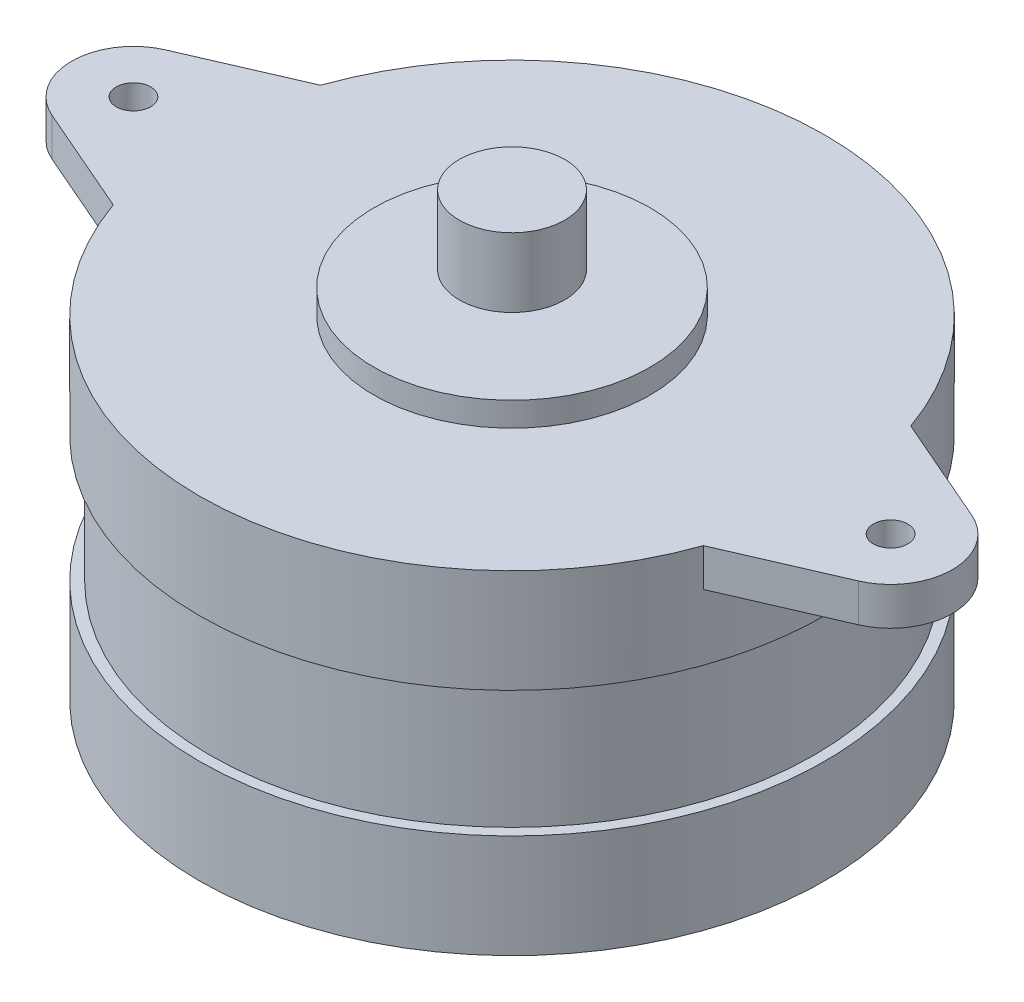
ISO-10303-21;
HEADER;
FILE_DESCRIPTION(('STEP AP214'),'2;1');
FILE_NAME('part.step','',(''),(''),'','','');
FILE_SCHEMA(('AUTOMOTIVE_DESIGN { 1 0 10303 214 1 1 1 1 }'));
ENDSEC;
DATA;
#1=APPLICATION_CONTEXT('core data for automotive mechanical design processes');
#2=APPLICATION_PROTOCOL_DEFINITION('international standard','automotive_design',2000,#1);
#3=PRODUCT_CONTEXT('',#1,'mechanical');
#4=PRODUCT('Part','Part','',(#3));
#5=PRODUCT_RELATED_PRODUCT_CATEGORY('part','',(#4));
#6=PRODUCT_DEFINITION_FORMATION('','',#4);
#7=PRODUCT_DEFINITION_CONTEXT('part definition',#1,'design');
#8=PRODUCT_DEFINITION('design','',#6,#7);
#9=PRODUCT_DEFINITION_SHAPE('','',#8);
#10=(LENGTH_UNIT() NAMED_UNIT(*) SI_UNIT(.MILLI.,.METRE.));
#11=(NAMED_UNIT(*) PLANE_ANGLE_UNIT() SI_UNIT($,.RADIAN.));
#12=(NAMED_UNIT(*) SI_UNIT($,.STERADIAN.) SOLID_ANGLE_UNIT());
#13=UNCERTAINTY_MEASURE_WITH_UNIT(LENGTH_MEASURE(1.E-05),#10,'distance_accuracy_value','');
#14=(GEOMETRIC_REPRESENTATION_CONTEXT(3) GLOBAL_UNCERTAINTY_ASSIGNED_CONTEXT((#13)) GLOBAL_UNIT_ASSIGNED_CONTEXT((#10,
#11,#12)) REPRESENTATION_CONTEXT('',''));
#15=CARTESIAN_POINT('',(0.,0.,0.));
#16=DIRECTION('',(0.,0.,1.));
#17=DIRECTION('',(1.,0.,0.));
#18=AXIS2_PLACEMENT_3D('',#15,#16,#17);
#19=CARTESIAN_POINT('',(0.,25.6,0.));
#20=DIRECTION('',(0.,1.,0.));
#21=DIRECTION('',(0.,0.,1.));
#22=AXIS2_PLACEMENT_3D('',#19,#20,#21);
#23=PLANE('',#22);
#24=CARTESIAN_POINT('',(0.,25.6,0.));
#25=DIRECTION('',(0.,-1.,0.));
#26=DIRECTION('',(0.,0.,-1.));
#27=AXIS2_PLACEMENT_3D('',#24,#25,#26);
#28=CIRCLE('',#27,3.05);
#29=CARTESIAN_POINT('',(0.,25.6,-3.05));
#30=VERTEX_POINT('',#29);
#31=EDGE_CURVE('E11',#30,#30,#28,.T.);
#32=ORIENTED_EDGE('',*,*,#31,.F.);
#33=EDGE_LOOP('',(#32));
#34=FACE_BOUND('',#33,.T.);
#35=ADVANCED_FACE('F41',(#34),#23,.T.);
#36=CARTESIAN_POINT('',(0.,0.,0.));
#37=DIRECTION('',(0.,-1.,0.));
#38=DIRECTION('',(0.,0.,-1.));
#39=AXIS2_PLACEMENT_3D('',#36,#37,#38);
#40=CYLINDRICAL_SURFACE('',#39,3.05);
#41=ORIENTED_EDGE('',*,*,#31,.T.);
#42=EDGE_LOOP('',(#41));
#43=FACE_BOUND('',#42,.T.);
#44=CARTESIAN_POINT('',(0.,21.6,0.));
#45=DIRECTION('',(0.,-1.,0.));
#46=DIRECTION('',(0.,0.,-1.));
#47=AXIS2_PLACEMENT_3D('',#44,#45,#46);
#48=CIRCLE('',#47,3.05);
#49=CARTESIAN_POINT('',(0.,21.6,-3.05));
#50=VERTEX_POINT('',#49);
#51=EDGE_CURVE('E48',#50,#50,#48,.T.);
#52=ORIENTED_EDGE('',*,*,#51,.F.);
#53=EDGE_LOOP('',(#52));
#54=FACE_BOUND('',#53,.T.);
#55=ADVANCED_FACE('F215',(#43,#54),#40,.T.);
#56=CARTESIAN_POINT('',(3.05,21.6,0.));
#57=DIRECTION('',(0.,-1.,0.));
#58=DIRECTION('',(0.,0.,-1.));
#59=AXIS2_PLACEMENT_3D('',#56,#57,#58);
#60=PLANE('',#59);
#61=ORIENTED_EDGE('',*,*,#51,.T.);
#62=EDGE_LOOP('',(#61));
#63=FACE_BOUND('',#62,.T.);
#64=CARTESIAN_POINT('',(0.,21.6,0.));
#65=DIRECTION('',(0.,-1.,0.));
#66=DIRECTION('',(0.,0.,-1.));
#67=AXIS2_PLACEMENT_3D('',#64,#65,#66);
#68=CIRCLE('',#67,1.25);
#69=CARTESIAN_POINT('',(0.,21.6,-1.25));
#70=VERTEX_POINT('',#69);
#71=EDGE_CURVE('E207',#70,#70,#68,.T.);
#72=ORIENTED_EDGE('',*,*,#71,.F.);
#73=EDGE_LOOP('',(#72));
#74=FACE_BOUND('',#73,.T.);
#75=ADVANCED_FACE('F212',(#63,#74),#60,.T.);
#76=CARTESIAN_POINT('',(0.,0.,0.));
#77=DIRECTION('',(0.,-1.,0.));
#78=DIRECTION('',(0.,0.,-1.));
#79=AXIS2_PLACEMENT_3D('',#76,#77,#78);
#80=CYLINDRICAL_SURFACE('',#79,1.25);
#81=ORIENTED_EDGE('',*,*,#71,.T.);
#82=EDGE_LOOP('',(#81));
#83=FACE_BOUND('',#82,.T.);
#84=CARTESIAN_POINT('',(0.,20.7,0.));
#85=DIRECTION('',(0.,-1.,0.));
#86=DIRECTION('',(0.,0.,-1.));
#87=AXIS2_PLACEMENT_3D('',#84,#85,#86);
#88=CIRCLE('',#87,1.25);
#89=CARTESIAN_POINT('',(0.,20.7,-1.25));
#90=VERTEX_POINT('',#89);
#91=EDGE_CURVE('E204',#90,#90,#88,.T.);
#92=ORIENTED_EDGE('',*,*,#91,.F.);
#93=EDGE_LOOP('',(#92));
#94=FACE_BOUND('',#93,.T.);
#95=ADVANCED_FACE('F222',(#83,#94),#80,.T.);
#96=CARTESIAN_POINT('',(1.25,20.7,0.));
#97=DIRECTION('',(0.,1.,0.));
#98=DIRECTION('',(0.,0.,1.));
#99=AXIS2_PLACEMENT_3D('',#96,#97,#98);
#100=PLANE('',#99);
#101=ORIENTED_EDGE('',*,*,#91,.T.);
#102=EDGE_LOOP('',(#101));
#103=FACE_BOUND('',#102,.T.);
#104=CARTESIAN_POINT('',(0.,20.7,0.));
#105=DIRECTION('',(0.,-1.,0.));
#106=DIRECTION('',(0.,0.,-1.));
#107=AXIS2_PLACEMENT_3D('',#104,#105,#106);
#108=CIRCLE('',#107,8.);
#109=CARTESIAN_POINT('',(0.,20.7,-8.));
#110=VERTEX_POINT('',#109);
#111=EDGE_CURVE('E201',#110,#110,#108,.T.);
#112=ORIENTED_EDGE('',*,*,#111,.F.);
#113=EDGE_LOOP('',(#112));
#114=FACE_BOUND('',#113,.T.);
#115=ADVANCED_FACE('F228',(#103,#114),#100,.T.);
#116=CARTESIAN_POINT('',(0.,0.,0.));
#117=DIRECTION('',(0.,-1.,0.));
#118=DIRECTION('',(0.,0.,-1.));
#119=AXIS2_PLACEMENT_3D('',#116,#117,#118);
#120=CYLINDRICAL_SURFACE('',#119,8.);
#121=ORIENTED_EDGE('',*,*,#111,.T.);
#122=EDGE_LOOP('',(#121));
#123=FACE_BOUND('',#122,.T.);
#124=CARTESIAN_POINT('',(0.,19.3,0.));
#125=DIRECTION('',(0.,-1.,0.));
#126=DIRECTION('',(0.,0.,-1.));
#127=AXIS2_PLACEMENT_3D('',#124,#125,#126);
#128=CIRCLE('',#127,8.);
#129=CARTESIAN_POINT('',(0.,19.3,-8.));
#130=VERTEX_POINT('',#129);
#131=EDGE_CURVE('E198',#130,#130,#128,.T.);
#132=ORIENTED_EDGE('',*,*,#131,.F.);
#133=EDGE_LOOP('',(#132));
#134=FACE_BOUND('',#133,.T.);
#135=ADVANCED_FACE('F232',(#123,#134),#120,.T.);
#136=CARTESIAN_POINT('',(8.,19.3,0.));
#137=DIRECTION('',(0.,1.,0.));
#138=DIRECTION('',(0.,0.,1.));
#139=AXIS2_PLACEMENT_3D('',#136,#137,#138);
#140=PLANE('',#139);
#141=ORIENTED_EDGE('',*,*,#131,.T.);
#142=EDGE_LOOP('',(#141));
#143=FACE_BOUND('',#142,.T.);
#144=CARTESIAN_POINT('',(0.,19.3,0.));
#145=DIRECTION('',(0.,-1.,0.));
#146=DIRECTION('',(0.,0.,-1.));
#147=AXIS2_PLACEMENT_3D('',#144,#145,#146);
#148=CIRCLE('',#147,18.11);
#149=CARTESIAN_POINT('',(-17.087191109132,19.3,-6.));
#150=VERTEX_POINT('',#149);
#151=CARTESIAN_POINT('',(17.087191109132,19.3,-6.));
#152=VERTEX_POINT('',#151);
#153=EDGE_CURVE('E196',#150,#152,#148,.T.);
#154=ORIENTED_EDGE('',*,*,#153,.F.);
#155=DIRECTION('',(-0.917335551166195,0.,0.398114916282488));
#156=VECTOR('',#155,1.);
#157=CARTESIAN_POINT('',(-23.3452514002913,19.3,-3.28406127317498));
#158=LINE('',#157,#156);
#159=CARTESIAN_POINT('',(-23.3452514002913,19.3,-3.28406127317498));
#160=VERTEX_POINT('',#159);
#161=EDGE_CURVE('E148',#150,#160,#158,.T.);
#162=ORIENTED_EDGE('',*,*,#161,.T.);
#163=CARTESIAN_POINT('',(-21.92,19.3,0.));
#164=DIRECTION('',(0.,1.,0.));
#165=DIRECTION('',(0.,0.,-1.));
#166=AXIS2_PLACEMENT_3D('',#163,#164,#165);
#167=CIRCLE('',#166,3.58);
#168=CARTESIAN_POINT('',(-23.3452514002913,19.3,3.28406127317498));
#169=VERTEX_POINT('',#168);
#170=EDGE_CURVE('E166',#160,#169,#167,.T.);
#171=ORIENTED_EDGE('',*,*,#170,.T.);
#172=DIRECTION('',(0.917335551166195,0.,0.398114916282488));
#173=VECTOR('',#172,1.);
#174=CARTESIAN_POINT('',(-23.3452514002913,19.3,3.28406127317498));
#175=LINE('',#174,#173);
#176=CARTESIAN_POINT('',(-17.087191109132,19.3,6.));
#177=VERTEX_POINT('',#176);
#178=EDGE_CURVE('E154',#169,#177,#175,.T.);
#179=ORIENTED_EDGE('',*,*,#178,.T.);
#180=CARTESIAN_POINT('',(17.087191109132,19.3,6.));
#181=VERTEX_POINT('',#180);
#182=EDGE_CURVE('E195',#181,#177,#148,.T.);
#183=ORIENTED_EDGE('',*,*,#182,.F.);
#184=DIRECTION('',(0.917335551166195,0.,-0.398114916282488));
#185=VECTOR('',#184,1.);
#186=CARTESIAN_POINT('',(17.087191109132,19.3,6.));
#187=LINE('',#186,#185);
#188=CARTESIAN_POINT('',(23.3452514002913,19.3,3.28406127317497));
#189=VERTEX_POINT('',#188);
#190=EDGE_CURVE('E123',#181,#189,#187,.T.);
#191=ORIENTED_EDGE('',*,*,#190,.T.);
#192=CARTESIAN_POINT('',(21.92,19.3,0.));
#193=DIRECTION('',(0.,1.,0.));
#194=DIRECTION('',(0.,0.,-1.));
#195=AXIS2_PLACEMENT_3D('',#192,#193,#194);
#196=CIRCLE('',#195,3.57999999999999);
#197=CARTESIAN_POINT('',(23.3452514002913,19.3,-3.28406127317498));
#198=VERTEX_POINT('',#197);
#199=EDGE_CURVE('E107',#189,#198,#196,.T.);
#200=ORIENTED_EDGE('',*,*,#199,.T.);
#201=DIRECTION('',(-0.917335551166195,0.,-0.398114916282489));
#202=VECTOR('',#201,1.);
#203=CARTESIAN_POINT('',(17.087191109132,19.3,-6.));
#204=LINE('',#203,#202);
#205=EDGE_CURVE('E121',#198,#152,#204,.T.);
#206=ORIENTED_EDGE('',*,*,#205,.T.);
#207=EDGE_LOOP('',(#154,#162,#171,#179,#183,#191,#200,#206));
#208=FACE_BOUND('',#207,.T.);
#209=CARTESIAN_POINT('',(-21.92,19.3,0.));
#210=DIRECTION('',(0.,1.,0.));
#211=DIRECTION('',(0.,0.,1.));
#212=AXIS2_PLACEMENT_3D('',#209,#210,#211);
#213=CIRCLE('',#212,0.999999999999998);
#214=CARTESIAN_POINT('',(-21.92,19.3,0.999999999999998));
#215=VERTEX_POINT('',#214);
#216=EDGE_CURVE('E142',#215,#215,#213,.T.);
#217=ORIENTED_EDGE('',*,*,#216,.F.);
#218=EDGE_LOOP('',(#217));
#219=FACE_BOUND('',#218,.T.);
#220=CARTESIAN_POINT('',(21.92,19.3,0.));
#221=DIRECTION('',(0.,1.,0.));
#222=DIRECTION('',(0.,0.,1.));
#223=AXIS2_PLACEMENT_3D('',#220,#221,#222);
#224=CIRCLE('',#223,0.999999999999998);
#225=CARTESIAN_POINT('',(21.92,19.3,0.999999999999998));
#226=VERTEX_POINT('',#225);
#227=EDGE_CURVE('E139',#226,#226,#224,.T.);
#228=ORIENTED_EDGE('',*,*,#227,.F.);
#229=EDGE_LOOP('',(#228));
#230=FACE_BOUND('',#229,.T.);
#231=ADVANCED_FACE('F119',(#143,#208,#219,#230),#140,.T.);
#232=CARTESIAN_POINT('',(0.,0.,0.));
#233=DIRECTION('',(0.,-1.,0.));
#234=DIRECTION('',(0.,0.,-1.));
#235=AXIS2_PLACEMENT_3D('',#232,#233,#234);
#236=CYLINDRICAL_SURFACE('',#235,18.11);
#237=DIRECTION('',(0.,1.,0.));
#238=VECTOR('',#237,1.);
#239=CARTESIAN_POINT('',(17.087191109132,17.1,-6.));
#240=LINE('',#239,#238);
#241=CARTESIAN_POINT('',(17.087191109132,17.1,-6.));
#242=VERTEX_POINT('',#241);
#243=EDGE_CURVE('E60',#242,#152,#240,.T.);
#244=ORIENTED_EDGE('',*,*,#243,.F.);
#245=CARTESIAN_POINT('',(0.,17.1,0.));
#246=DIRECTION('',(0.,-1.,0.));
#247=DIRECTION('',(0.,0.,1.));
#248=AXIS2_PLACEMENT_3D('',#245,#246,#247);
#249=CIRCLE('',#248,18.11);
#250=CARTESIAN_POINT('',(17.087191109132,17.1,6.));
#251=VERTEX_POINT('',#250);
#252=EDGE_CURVE('E55',#242,#251,#249,.T.);
#253=ORIENTED_EDGE('',*,*,#252,.T.);
#254=DIRECTION('',(0.,1.,0.));
#255=VECTOR('',#254,1.);
#256=CARTESIAN_POINT('',(17.087191109132,17.1,6.));
#257=LINE('',#256,#255);
#258=EDGE_CURVE('E135',#251,#181,#257,.T.);
#259=ORIENTED_EDGE('',*,*,#258,.T.);
#260=ORIENTED_EDGE('',*,*,#182,.T.);
#261=DIRECTION('',(0.,1.,0.));
#262=VECTOR('',#261,1.);
#263=CARTESIAN_POINT('',(-17.087191109132,17.1,6.));
#264=LINE('',#263,#262);
#265=CARTESIAN_POINT('',(-17.087191109132,17.1,6.));
#266=VERTEX_POINT('',#265);
#267=EDGE_CURVE('E171',#266,#177,#264,.T.);
#268=ORIENTED_EDGE('',*,*,#267,.F.);
#269=CARTESIAN_POINT('',(0.,17.1,0.));
#270=DIRECTION('',(0.,-1.,0.));
#271=DIRECTION('',(0.,0.,1.));
#272=AXIS2_PLACEMENT_3D('',#269,#270,#271);
#273=CIRCLE('',#272,18.11);
#274=CARTESIAN_POINT('',(-17.087191109132,17.1,-6.));
#275=VERTEX_POINT('',#274);
#276=EDGE_CURVE('E151',#266,#275,#273,.T.);
#277=ORIENTED_EDGE('',*,*,#276,.T.);
#278=DIRECTION('',(0.,1.,0.));
#279=VECTOR('',#278,1.);
#280=CARTESIAN_POINT('',(-17.087191109132,17.1,-6.));
#281=LINE('',#280,#279);
#282=EDGE_CURVE('E163',#275,#150,#281,.T.);
#283=ORIENTED_EDGE('',*,*,#282,.T.);
#284=ORIENTED_EDGE('',*,*,#153,.T.);
#285=EDGE_LOOP('',(#244,#253,#259,#260,#268,#277,#283,#284));
#286=FACE_BOUND('',#285,.T.);
#287=CARTESIAN_POINT('',(0.,13.3,0.));
#288=DIRECTION('',(0.,-1.,0.));
#289=DIRECTION('',(0.,0.,-1.));
#290=AXIS2_PLACEMENT_3D('',#287,#288,#289);
#291=CIRCLE('',#290,18.11);
#292=CARTESIAN_POINT('',(0.,13.3,-18.11));
#293=VERTEX_POINT('',#292);
#294=EDGE_CURVE('E192',#293,#293,#291,.T.);
#295=ORIENTED_EDGE('',*,*,#294,.F.);
#296=EDGE_LOOP('',(#295));
#297=FACE_BOUND('',#296,.T.);
#298=ADVANCED_FACE('F239',(#286,#297),#236,.T.);
#299=CARTESIAN_POINT('',(18.11,13.3,0.));
#300=DIRECTION('',(0.,-1.,0.));
#301=DIRECTION('',(0.,0.,-1.));
#302=AXIS2_PLACEMENT_3D('',#299,#300,#301);
#303=PLANE('',#302);
#304=ORIENTED_EDGE('',*,*,#294,.T.);
#305=EDGE_LOOP('',(#304));
#306=FACE_BOUND('',#305,.T.);
#307=CARTESIAN_POINT('',(0.,13.3,0.));
#308=DIRECTION('',(0.,-1.,0.));
#309=DIRECTION('',(0.,0.,-1.));
#310=AXIS2_PLACEMENT_3D('',#307,#308,#309);
#311=CIRCLE('',#310,17.5);
#312=CARTESIAN_POINT('',(0.,13.3,-17.5));
#313=VERTEX_POINT('',#312);
#314=EDGE_CURVE('E189',#313,#313,#311,.T.);
#315=ORIENTED_EDGE('',*,*,#314,.F.);
#316=EDGE_LOOP('',(#315));
#317=FACE_BOUND('',#316,.T.);
#318=ADVANCED_FACE('F243',(#306,#317),#303,.T.);
#319=CARTESIAN_POINT('',(0.,0.,0.));
#320=DIRECTION('',(0.,-1.,0.));
#321=DIRECTION('',(0.,0.,-1.));
#322=AXIS2_PLACEMENT_3D('',#319,#320,#321);
#323=CYLINDRICAL_SURFACE('',#322,17.5);
#324=ORIENTED_EDGE('',*,*,#314,.T.);
#325=EDGE_LOOP('',(#324));
#326=FACE_BOUND('',#325,.T.);
#327=CARTESIAN_POINT('',(0.,6.,0.));
#328=DIRECTION('',(0.,-1.,0.));
#329=DIRECTION('',(0.,0.,-1.));
#330=AXIS2_PLACEMENT_3D('',#327,#328,#329);
#331=CIRCLE('',#330,17.5);
#332=CARTESIAN_POINT('',(0.,6.,-17.5));
#333=VERTEX_POINT('',#332);
#334=EDGE_CURVE('E186',#333,#333,#331,.T.);
#335=ORIENTED_EDGE('',*,*,#334,.F.);
#336=EDGE_LOOP('',(#335));
#337=FACE_BOUND('',#336,.T.);
#338=ADVANCED_FACE('F246',(#326,#337),#323,.T.);
#339=CARTESIAN_POINT('',(17.5,6.,0.));
#340=DIRECTION('',(0.,1.,0.));
#341=DIRECTION('',(0.,0.,1.));
#342=AXIS2_PLACEMENT_3D('',#339,#340,#341);
#343=PLANE('',#342);
#344=ORIENTED_EDGE('',*,*,#334,.T.);
#345=EDGE_LOOP('',(#344));
#346=FACE_BOUND('',#345,.T.);
#347=CARTESIAN_POINT('',(0.,6.,0.));
#348=DIRECTION('',(0.,-1.,0.));
#349=DIRECTION('',(0.,0.,-1.));
#350=AXIS2_PLACEMENT_3D('',#347,#348,#349);
#351=CIRCLE('',#350,18.11);
#352=CARTESIAN_POINT('',(0.,6.,-18.11));
#353=VERTEX_POINT('',#352);
#354=EDGE_CURVE('E183',#353,#353,#351,.T.);
#355=ORIENTED_EDGE('',*,*,#354,.F.);
#356=EDGE_LOOP('',(#355));
#357=FACE_BOUND('',#356,.T.);
#358=ADVANCED_FACE('F250',(#346,#357),#343,.T.);
#359=CARTESIAN_POINT('',(0.,0.,0.));
#360=DIRECTION('',(0.,-1.,0.));
#361=DIRECTION('',(0.,0.,-1.));
#362=AXIS2_PLACEMENT_3D('',#359,#360,#361);
#363=CYLINDRICAL_SURFACE('',#362,18.11);
#364=ORIENTED_EDGE('',*,*,#354,.T.);
#365=EDGE_LOOP('',(#364));
#366=FACE_BOUND('',#365,.T.);
#367=CARTESIAN_POINT('',(0.,0.,0.));
#368=DIRECTION('',(0.,-1.,0.));
#369=DIRECTION('',(0.,0.,-1.));
#370=AXIS2_PLACEMENT_3D('',#367,#368,#369);
#371=CIRCLE('',#370,18.11);
#372=CARTESIAN_POINT('',(0.,0.,-18.11));
#373=VERTEX_POINT('',#372);
#374=EDGE_CURVE('E174',#373,#373,#371,.T.);
#375=ORIENTED_EDGE('',*,*,#374,.F.);
#376=EDGE_LOOP('',(#375));
#377=FACE_BOUND('',#376,.T.);
#378=ADVANCED_FACE('F254',(#366,#377),#363,.T.);
#379=CARTESIAN_POINT('',(18.11,0.,0.));
#380=DIRECTION('',(0.,-1.,0.));
#381=DIRECTION('',(0.,0.,-1.));
#382=AXIS2_PLACEMENT_3D('',#379,#380,#381);
#383=PLANE('',#382);
#384=ORIENTED_EDGE('',*,*,#374,.T.);
#385=EDGE_LOOP('',(#384));
#386=FACE_BOUND('',#385,.T.);
#387=ADVANCED_FACE('F258',(#386),#383,.T.);
#388=CARTESIAN_POINT('',(-23.3452514002913,17.1,3.28406127317498));
#389=DIRECTION('',(-0.398114916282488,0.,0.917335551166195));
#390=DIRECTION('',(0.917335551166195,0.,0.398114916282488));
#391=AXIS2_PLACEMENT_3D('',#388,#389,#390);
#392=PLANE('',#391);
#393=ORIENTED_EDGE('',*,*,#178,.F.);
#394=DIRECTION('',(0.,1.,0.));
#395=VECTOR('',#394,1.);
#396=CARTESIAN_POINT('',(-23.3452514002913,17.1,3.28406127317498));
#397=LINE('',#396,#395);
#398=CARTESIAN_POINT('',(-23.3452514002913,17.1,3.28406127317498));
#399=VERTEX_POINT('',#398);
#400=EDGE_CURVE('E175',#399,#169,#397,.T.);
#401=ORIENTED_EDGE('',*,*,#400,.F.);
#402=DIRECTION('',(0.917335551166195,0.,0.398114916282488));
#403=VECTOR('',#402,1.);
#404=CARTESIAN_POINT('',(-23.3452514002913,17.1,3.28406127317498));
#405=LINE('',#404,#403);
#406=EDGE_CURVE('E160',#399,#266,#405,.T.);
#407=ORIENTED_EDGE('',*,*,#406,.T.);
#408=ORIENTED_EDGE('',*,*,#267,.T.);
#409=EDGE_LOOP('',(#393,#401,#407,#408));
#410=FACE_BOUND('',#409,.T.);
#411=ADVANCED_FACE('F262',(#410),#392,.T.);
#412=CARTESIAN_POINT('',(-21.92,17.1,0.));
#413=DIRECTION('',(0.,1.,0.));
#414=DIRECTION('',(0.,0.,1.));
#415=AXIS2_PLACEMENT_3D('',#412,#413,#414);
#416=CYLINDRICAL_SURFACE('',#415,3.58);
#417=ORIENTED_EDGE('',*,*,#170,.F.);
#418=DIRECTION('',(0.,1.,0.));
#419=VECTOR('',#418,1.);
#420=CARTESIAN_POINT('',(-23.3452514002913,17.1,-3.28406127317498));
#421=LINE('',#420,#419);
#422=CARTESIAN_POINT('',(-23.3452514002913,17.1,-3.28406127317498));
#423=VERTEX_POINT('',#422);
#424=EDGE_CURVE('E177',#423,#160,#421,.T.);
#425=ORIENTED_EDGE('',*,*,#424,.F.);
#426=CARTESIAN_POINT('',(-21.92,17.1,0.));
#427=DIRECTION('',(0.,1.,0.));
#428=DIRECTION('',(0.,0.,-1.));
#429=AXIS2_PLACEMENT_3D('',#426,#427,#428);
#430=CIRCLE('',#429,3.58);
#431=EDGE_CURVE('E157',#423,#399,#430,.T.);
#432=ORIENTED_EDGE('',*,*,#431,.T.);
#433=ORIENTED_EDGE('',*,*,#400,.T.);
#434=EDGE_LOOP('',(#417,#425,#432,#433));
#435=FACE_BOUND('',#434,.T.);
#436=ADVANCED_FACE('F268',(#435),#416,.T.);
#437=CARTESIAN_POINT('',(-23.3452514002913,17.1,-3.28406127317498));
#438=DIRECTION('',(-0.398114916282488,0.,-0.917335551166195));
#439=DIRECTION('',(-0.917335551166196,0.,0.398114916282488));
#440=AXIS2_PLACEMENT_3D('',#437,#438,#439);
#441=PLANE('',#440);
#442=ORIENTED_EDGE('',*,*,#161,.F.);
#443=ORIENTED_EDGE('',*,*,#282,.F.);
#444=DIRECTION('',(-0.917335551166195,0.,0.398114916282488));
#445=VECTOR('',#444,1.);
#446=CARTESIAN_POINT('',(-23.3452514002913,17.1,-3.28406127317498));
#447=LINE('',#446,#445);
#448=EDGE_CURVE('E153',#275,#423,#447,.T.);
#449=ORIENTED_EDGE('',*,*,#448,.T.);
#450=ORIENTED_EDGE('',*,*,#424,.T.);
#451=EDGE_LOOP('',(#442,#443,#449,#450));
#452=FACE_BOUND('',#451,.T.);
#453=ADVANCED_FACE('F264',(#452),#441,.T.);
#454=CARTESIAN_POINT('',(0.,17.1,0.));
#455=DIRECTION('',(0.,1.,0.));
#456=DIRECTION('',(0.,0.,1.));
#457=AXIS2_PLACEMENT_3D('',#454,#455,#456);
#458=PLANE('',#457);
#459=CARTESIAN_POINT('',(-21.92,17.1,0.));
#460=DIRECTION('',(0.,1.,0.));
#461=DIRECTION('',(0.,0.,1.));
#462=AXIS2_PLACEMENT_3D('',#459,#460,#461);
#463=CIRCLE('',#462,0.999999999999998);
#464=CARTESIAN_POINT('',(-21.92,17.1,0.999999999999998));
#465=VERTEX_POINT('',#464);
#466=EDGE_CURVE('E145',#465,#465,#463,.T.);
#467=ORIENTED_EDGE('',*,*,#466,.T.);
#468=EDGE_LOOP('',(#467));
#469=FACE_BOUND('',#468,.T.);
#470=ORIENTED_EDGE('',*,*,#276,.F.);
#471=ORIENTED_EDGE('',*,*,#406,.F.);
#472=ORIENTED_EDGE('',*,*,#431,.F.);
#473=ORIENTED_EDGE('',*,*,#448,.F.);
#474=EDGE_LOOP('',(#470,#471,#472,#473));
#475=FACE_BOUND('',#474,.T.);
#476=ADVANCED_FACE('F267',(#469,#475),#458,.F.);
#477=CARTESIAN_POINT('',(-21.92,17.1,0.));
#478=DIRECTION('',(0.,1.,0.));
#479=DIRECTION('',(0.,0.,1.));
#480=AXIS2_PLACEMENT_3D('',#477,#478,#479);
#481=CYLINDRICAL_SURFACE('',#480,0.999999999999998);
#482=ORIENTED_EDGE('',*,*,#466,.F.);
#483=EDGE_LOOP('',(#482));
#484=FACE_BOUND('',#483,.T.);
#485=ORIENTED_EDGE('',*,*,#216,.T.);
#486=EDGE_LOOP('',(#485));
#487=FACE_BOUND('',#486,.T.);
#488=ADVANCED_FACE('F278',(#484,#487),#481,.F.);
#489=CARTESIAN_POINT('',(17.087191109132,17.1,-6.));
#490=DIRECTION('',(0.398114916282489,0.,-0.917335551166195));
#491=DIRECTION('',(-0.917335551166195,0.,-0.398114916282489));
#492=AXIS2_PLACEMENT_3D('',#489,#490,#491);
#493=PLANE('',#492);
#494=ORIENTED_EDGE('',*,*,#205,.F.);
#495=DIRECTION('',(0.,1.,0.));
#496=VECTOR('',#495,1.);
#497=CARTESIAN_POINT('',(23.3452514002913,17.1,-3.28406127317498));
#498=LINE('',#497,#496);
#499=CARTESIAN_POINT('',(23.3452514002913,17.1,-3.28406127317498));
#500=VERTEX_POINT('',#499);
#501=EDGE_CURVE('E104',#500,#198,#498,.T.);
#502=ORIENTED_EDGE('',*,*,#501,.F.);
#503=DIRECTION('',(-0.917335551166195,0.,-0.398114916282489));
#504=VECTOR('',#503,1.);
#505=CARTESIAN_POINT('',(17.087191109132,17.1,-6.));
#506=LINE('',#505,#504);
#507=EDGE_CURVE('E133',#500,#242,#506,.T.);
#508=ORIENTED_EDGE('',*,*,#507,.T.);
#509=ORIENTED_EDGE('',*,*,#243,.T.);
#510=EDGE_LOOP('',(#494,#502,#508,#509));
#511=FACE_BOUND('',#510,.T.);
#512=ADVANCED_FACE('F125',(#511),#493,.T.);
#513=CARTESIAN_POINT('',(21.92,17.1,0.));
#514=DIRECTION('',(0.,1.,0.));
#515=DIRECTION('',(0.,0.,1.));
#516=AXIS2_PLACEMENT_3D('',#513,#514,#515);
#517=CYLINDRICAL_SURFACE('',#516,3.57999999999999);
#518=ORIENTED_EDGE('',*,*,#199,.F.);
#519=DIRECTION('',(0.,1.,0.));
#520=VECTOR('',#519,1.);
#521=CARTESIAN_POINT('',(23.3452514002913,17.1,3.28406127317497));
#522=LINE('',#521,#520);
#523=CARTESIAN_POINT('',(23.3452514002913,17.1,3.28406127317497));
#524=VERTEX_POINT('',#523);
#525=EDGE_CURVE('E115',#524,#189,#522,.T.);
#526=ORIENTED_EDGE('',*,*,#525,.F.);
#527=CARTESIAN_POINT('',(21.92,17.1,0.));
#528=DIRECTION('',(0.,1.,0.));
#529=DIRECTION('',(0.,0.,-1.));
#530=AXIS2_PLACEMENT_3D('',#527,#528,#529);
#531=CIRCLE('',#530,3.57999999999999);
#532=EDGE_CURVE('E110',#524,#500,#531,.T.);
#533=ORIENTED_EDGE('',*,*,#532,.T.);
#534=ORIENTED_EDGE('',*,*,#501,.T.);
#535=EDGE_LOOP('',(#518,#526,#533,#534));
#536=FACE_BOUND('',#535,.T.);
#537=ADVANCED_FACE('F106',(#536),#517,.T.);
#538=CARTESIAN_POINT('',(17.087191109132,17.1,6.));
#539=DIRECTION('',(0.398114916282488,0.,0.917335551166195));
#540=DIRECTION('',(0.917335551166195,0.,-0.398114916282488));
#541=AXIS2_PLACEMENT_3D('',#538,#539,#540);
#542=PLANE('',#541);
#543=ORIENTED_EDGE('',*,*,#190,.F.);
#544=ORIENTED_EDGE('',*,*,#258,.F.);
#545=DIRECTION('',(0.917335551166195,0.,-0.398114916282488));
#546=VECTOR('',#545,1.);
#547=CARTESIAN_POINT('',(17.087191109132,17.1,6.));
#548=LINE('',#547,#546);
#549=EDGE_CURVE('E127',#251,#524,#548,.T.);
#550=ORIENTED_EDGE('',*,*,#549,.T.);
#551=ORIENTED_EDGE('',*,*,#525,.T.);
#552=EDGE_LOOP('',(#543,#544,#550,#551));
#553=FACE_BOUND('',#552,.T.);
#554=ADVANCED_FACE('F290',(#553),#542,.T.);
#555=CARTESIAN_POINT('',(0.,17.1,0.));
#556=DIRECTION('',(0.,1.,0.));
#557=DIRECTION('',(0.,0.,1.));
#558=AXIS2_PLACEMENT_3D('',#555,#556,#557);
#559=PLANE('',#558);
#560=CARTESIAN_POINT('',(21.92,17.1,0.));
#561=DIRECTION('',(0.,1.,0.));
#562=DIRECTION('',(0.,0.,1.));
#563=AXIS2_PLACEMENT_3D('',#560,#561,#562);
#564=CIRCLE('',#563,0.999999999999998);
#565=CARTESIAN_POINT('',(21.92,17.1,0.999999999999998));
#566=VERTEX_POINT('',#565);
#567=EDGE_CURVE('E132',#566,#566,#564,.T.);
#568=ORIENTED_EDGE('',*,*,#567,.T.);
#569=EDGE_LOOP('',(#568));
#570=FACE_BOUND('',#569,.T.);
#571=ORIENTED_EDGE('',*,*,#252,.F.);
#572=ORIENTED_EDGE('',*,*,#507,.F.);
#573=ORIENTED_EDGE('',*,*,#532,.F.);
#574=ORIENTED_EDGE('',*,*,#549,.F.);
#575=EDGE_LOOP('',(#571,#572,#573,#574));
#576=FACE_BOUND('',#575,.T.);
#577=ADVANCED_FACE('F286',(#570,#576),#559,.F.);
#578=CARTESIAN_POINT('',(21.92,17.1,0.));
#579=DIRECTION('',(0.,1.,0.));
#580=DIRECTION('',(0.,0.,1.));
#581=AXIS2_PLACEMENT_3D('',#578,#579,#580);
#582=CYLINDRICAL_SURFACE('',#581,0.999999999999998);
#583=ORIENTED_EDGE('',*,*,#567,.F.);
#584=EDGE_LOOP('',(#583));
#585=FACE_BOUND('',#584,.T.);
#586=ORIENTED_EDGE('',*,*,#227,.T.);
#587=EDGE_LOOP('',(#586));
#588=FACE_BOUND('',#587,.T.);
#589=ADVANCED_FACE('F283',(#585,#588),#582,.F.);
#590=CLOSED_SHELL('',(#35,#55,#75,#95,#115,#135,#231,#298,#318,#338,#358,#378,#387,#411,#436,
#453,#476,#488,#512,#537,#554,#577,#589));
#591=MANIFOLD_SOLID_BREP('B2',#590);
#592=ADVANCED_BREP_SHAPE_REPRESENTATION('',(#18,#591),#14);
#593=SHAPE_DEFINITION_REPRESENTATION(#9,#592);
ENDSEC;
END-ISO-10303-21;
